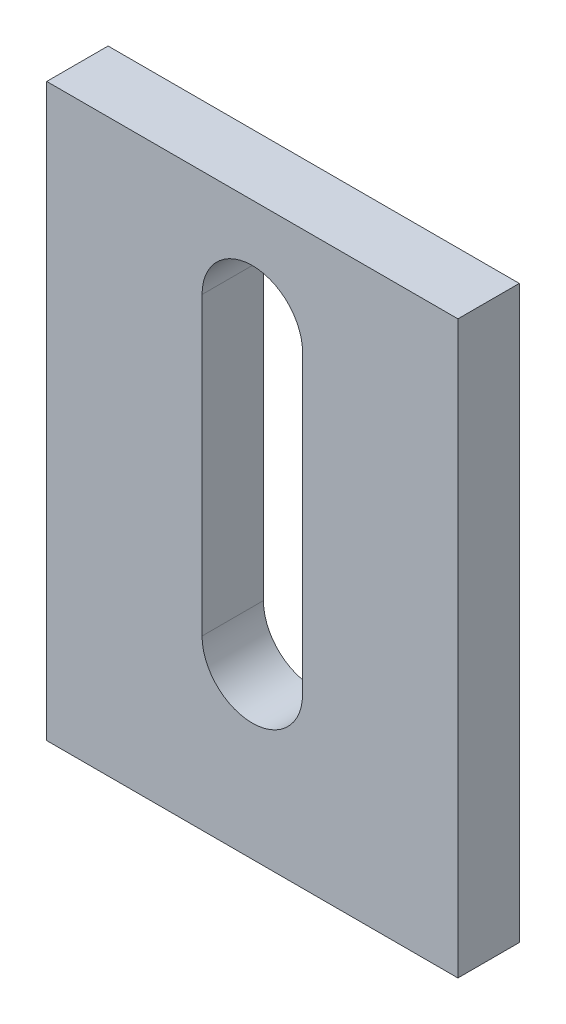
ISO-10303-21;
HEADER;
FILE_DESCRIPTION(('STEP AP214'),'2;1');
FILE_NAME('part.step','',(''),(''),'','','');
FILE_SCHEMA(('AUTOMOTIVE_DESIGN { 1 0 10303 214 1 1 1 1 }'));
ENDSEC;
DATA;
#1=APPLICATION_CONTEXT('core data for automotive mechanical design processes');
#2=APPLICATION_PROTOCOL_DEFINITION('international standard','automotive_design',2000,#1);
#3=PRODUCT_CONTEXT('',#1,'mechanical');
#4=PRODUCT('Part','Part','',(#3));
#5=PRODUCT_RELATED_PRODUCT_CATEGORY('part','',(#4));
#6=PRODUCT_DEFINITION_FORMATION('','',#4);
#7=PRODUCT_DEFINITION_CONTEXT('part definition',#1,'design');
#8=PRODUCT_DEFINITION('design','',#6,#7);
#9=PRODUCT_DEFINITION_SHAPE('','',#8);
#10=(LENGTH_UNIT() NAMED_UNIT(*) SI_UNIT(.MILLI.,.METRE.));
#11=(NAMED_UNIT(*) PLANE_ANGLE_UNIT() SI_UNIT($,.RADIAN.));
#12=(NAMED_UNIT(*) SI_UNIT($,.STERADIAN.) SOLID_ANGLE_UNIT());
#13=UNCERTAINTY_MEASURE_WITH_UNIT(LENGTH_MEASURE(1.E-05),#10,'distance_accuracy_value','');
#14=(GEOMETRIC_REPRESENTATION_CONTEXT(3) GLOBAL_UNCERTAINTY_ASSIGNED_CONTEXT((#13)) GLOBAL_UNIT_ASSIGNED_CONTEXT((#10,
#11,#12)) REPRESENTATION_CONTEXT('',''));
#15=CARTESIAN_POINT('',(0.,0.,0.));
#16=DIRECTION('',(0.,0.,1.));
#17=DIRECTION('',(1.,0.,0.));
#18=AXIS2_PLACEMENT_3D('',#15,#16,#17);
#19=CARTESIAN_POINT('',(3.,0.,4.3));
#20=DIRECTION('',(-1.,0.,0.));
#21=DIRECTION('',(0.,0.,1.));
#22=AXIS2_PLACEMENT_3D('',#19,#20,#21);
#23=PLANE('',#22);
#24=DIRECTION('',(0.,1.,0.));
#25=VECTOR('',#24,1.);
#26=CARTESIAN_POINT('',(3.,0.,0.));
#27=LINE('',#26,#25);
#28=CARTESIAN_POINT('',(3.,-40.,0.));
#29=VERTEX_POINT('',#28);
#30=CARTESIAN_POINT('',(3.,0.,0.));
#31=VERTEX_POINT('',#30);
#32=EDGE_CURVE('E143',#29,#31,#27,.T.);
#33=ORIENTED_EDGE('',*,*,#32,.F.);
#34=DIRECTION('',(0.,0.,-1.));
#35=VECTOR('',#34,1.);
#36=CARTESIAN_POINT('',(3.,-40.,4.3));
#37=LINE('',#36,#35);
#38=CARTESIAN_POINT('',(3.,-40.,4.3));
#39=VERTEX_POINT('',#38);
#40=EDGE_CURVE('E11',#39,#29,#37,.T.);
#41=ORIENTED_EDGE('',*,*,#40,.F.);
#42=DIRECTION('',(0.,1.,0.));
#43=VECTOR('',#42,1.);
#44=CARTESIAN_POINT('',(3.,0.,4.3));
#45=LINE('',#44,#43);
#46=CARTESIAN_POINT('',(3.,0.,4.3));
#47=VERTEX_POINT('',#46);
#48=EDGE_CURVE('E122',#39,#47,#45,.T.);
#49=ORIENTED_EDGE('',*,*,#48,.T.);
#50=DIRECTION('',(0.,0.,-1.));
#51=VECTOR('',#50,1.);
#52=CARTESIAN_POINT('',(3.,0.,4.3));
#53=LINE('',#52,#51);
#54=EDGE_CURVE('E54',#47,#31,#53,.T.);
#55=ORIENTED_EDGE('',*,*,#54,.T.);
#56=EDGE_LOOP('',(#33,#41,#49,#55));
#57=FACE_BOUND('',#56,.T.);
#58=ADVANCED_FACE('F35',(#57),#23,.T.);
#59=CARTESIAN_POINT('',(0.,-40.,4.3));
#60=DIRECTION('',(0.,-1.,0.));
#61=DIRECTION('',(0.,0.,-1.));
#62=AXIS2_PLACEMENT_3D('',#59,#60,#61);
#63=PLANE('',#62);
#64=DIRECTION('',(-1.,0.,0.));
#65=VECTOR('',#64,1.);
#66=CARTESIAN_POINT('',(0.,-40.,0.));
#67=LINE('',#66,#65);
#68=CARTESIAN_POINT('',(31.8124195048387,-40.,0.));
#69=VERTEX_POINT('',#68);
#70=EDGE_CURVE('E111',#69,#29,#67,.T.);
#71=ORIENTED_EDGE('',*,*,#70,.F.);
#72=DIRECTION('',(0.,0.,-1.));
#73=VECTOR('',#72,1.);
#74=CARTESIAN_POINT('',(31.8124195048387,-40.,4.3));
#75=LINE('',#74,#73);
#76=CARTESIAN_POINT('',(31.8124195048387,-40.,4.3));
#77=VERTEX_POINT('',#76);
#78=EDGE_CURVE('E45',#77,#69,#75,.T.);
#79=ORIENTED_EDGE('',*,*,#78,.F.);
#80=DIRECTION('',(-1.,0.,0.));
#81=VECTOR('',#80,1.);
#82=CARTESIAN_POINT('',(0.,-40.,4.3));
#83=LINE('',#82,#81);
#84=EDGE_CURVE('E109',#77,#39,#83,.T.);
#85=ORIENTED_EDGE('',*,*,#84,.T.);
#86=ORIENTED_EDGE('',*,*,#40,.T.);
#87=EDGE_LOOP('',(#71,#79,#85,#86));
#88=FACE_BOUND('',#87,.T.);
#89=ADVANCED_FACE('F108',(#88),#63,.T.);
#90=CARTESIAN_POINT('',(31.8124195048387,0.,4.3));
#91=DIRECTION('',(1.,0.,0.));
#92=DIRECTION('',(0.,0.,-1.));
#93=AXIS2_PLACEMENT_3D('',#90,#91,#92);
#94=PLANE('',#93);
#95=DIRECTION('',(0.,-1.,0.));
#96=VECTOR('',#95,1.);
#97=CARTESIAN_POINT('',(31.8124195048387,0.,0.));
#98=LINE('',#97,#96);
#99=CARTESIAN_POINT('',(31.8124195048387,0.,0.));
#100=VERTEX_POINT('',#99);
#101=EDGE_CURVE('E146',#100,#69,#98,.T.);
#102=ORIENTED_EDGE('',*,*,#101,.F.);
#103=DIRECTION('',(0.,0.,-1.));
#104=VECTOR('',#103,1.);
#105=CARTESIAN_POINT('',(31.8124195048387,0.,4.3));
#106=LINE('',#105,#104);
#107=CARTESIAN_POINT('',(31.8124195048387,0.,4.3));
#108=VERTEX_POINT('',#107);
#109=EDGE_CURVE('E79',#108,#100,#106,.T.);
#110=ORIENTED_EDGE('',*,*,#109,.F.);
#111=DIRECTION('',(0.,-1.,0.));
#112=VECTOR('',#111,1.);
#113=CARTESIAN_POINT('',(31.8124195048387,0.,4.3));
#114=LINE('',#113,#112);
#115=EDGE_CURVE('E121',#108,#77,#114,.T.);
#116=ORIENTED_EDGE('',*,*,#115,.T.);
#117=ORIENTED_EDGE('',*,*,#78,.T.);
#118=EDGE_LOOP('',(#102,#110,#116,#117));
#119=FACE_BOUND('',#118,.T.);
#120=ADVANCED_FACE('F124',(#119),#94,.T.);
#121=CARTESIAN_POINT('',(17.4062097524194,-28.212407831461,4.3));
#122=DIRECTION('',(0.,0.,-1.));
#123=DIRECTION('',(-1.,0.,0.));
#124=AXIS2_PLACEMENT_3D('',#121,#122,#123);
#125=CYLINDRICAL_SURFACE('',#124,3.52216237368795);
#126=CARTESIAN_POINT('',(17.4062097524194,-28.212407831461,0.));
#127=DIRECTION('',(0.,0.,1.));
#128=DIRECTION('',(1.,0.,0.));
#129=AXIS2_PLACEMENT_3D('',#126,#127,#128);
#130=CIRCLE('',#129,3.52216237368795);
#131=CARTESIAN_POINT('',(13.8840473787314,-28.212407831461,0.));
#132=VERTEX_POINT('',#131);
#133=CARTESIAN_POINT('',(20.9283721261073,-28.212407831461,0.));
#134=VERTEX_POINT('',#133);
#135=EDGE_CURVE('E131',#132,#134,#130,.T.);
#136=ORIENTED_EDGE('',*,*,#135,.F.);
#137=DIRECTION('',(0.,0.,-1.));
#138=VECTOR('',#137,1.);
#139=CARTESIAN_POINT('',(13.8840473787314,-28.212407831461,4.3));
#140=LINE('',#139,#138);
#141=CARTESIAN_POINT('',(13.8840473787314,-28.212407831461,4.3));
#142=VERTEX_POINT('',#141);
#143=EDGE_CURVE('E39',#142,#132,#140,.T.);
#144=ORIENTED_EDGE('',*,*,#143,.F.);
#145=CARTESIAN_POINT('',(17.4062097524194,-28.212407831461,4.3));
#146=DIRECTION('',(0.,0.,1.));
#147=DIRECTION('',(1.,0.,0.));
#148=AXIS2_PLACEMENT_3D('',#145,#146,#147);
#149=CIRCLE('',#148,3.52216237368795);
#150=CARTESIAN_POINT('',(20.9283721261073,-28.212407831461,4.3));
#151=VERTEX_POINT('',#150);
#152=EDGE_CURVE('E151',#142,#151,#149,.T.);
#153=ORIENTED_EDGE('',*,*,#152,.T.);
#154=DIRECTION('',(0.,0.,-1.));
#155=VECTOR('',#154,1.);
#156=CARTESIAN_POINT('',(20.9283721261073,-28.212407831461,4.3));
#157=LINE('',#156,#155);
#158=EDGE_CURVE('E127',#151,#134,#157,.T.);
#159=ORIENTED_EDGE('',*,*,#158,.T.);
#160=EDGE_LOOP('',(#136,#144,#153,#159));
#161=FACE_BOUND('',#160,.T.);
#162=ADVANCED_FACE('F37',(#161),#125,.F.);
#163=CARTESIAN_POINT('',(13.8840473787314,0.,4.3));
#164=DIRECTION('',(1.,0.,0.));
#165=DIRECTION('',(0.,0.,-1.));
#166=AXIS2_PLACEMENT_3D('',#163,#164,#165);
#167=PLANE('',#166);
#168=DIRECTION('',(0.,-1.,0.));
#169=VECTOR('',#168,1.);
#170=CARTESIAN_POINT('',(13.8840473787314,0.,0.));
#171=LINE('',#170,#169);
#172=CARTESIAN_POINT('',(13.8840473787314,-7.48759216853905,0.));
#173=VERTEX_POINT('',#172);
#174=EDGE_CURVE('E134',#173,#132,#171,.T.);
#175=ORIENTED_EDGE('',*,*,#174,.F.);
#176=DIRECTION('',(0.,0.,-1.));
#177=VECTOR('',#176,1.);
#178=CARTESIAN_POINT('',(13.8840473787314,-7.48759216853905,4.3));
#179=LINE('',#178,#177);
#180=CARTESIAN_POINT('',(13.8840473787314,-7.48759216853905,4.3));
#181=VERTEX_POINT('',#180);
#182=EDGE_CURVE('E156',#181,#173,#179,.T.);
#183=ORIENTED_EDGE('',*,*,#182,.F.);
#184=DIRECTION('',(0.,-1.,0.));
#185=VECTOR('',#184,1.);
#186=CARTESIAN_POINT('',(13.8840473787314,0.,4.3));
#187=LINE('',#186,#185);
#188=EDGE_CURVE('E165',#181,#142,#187,.T.);
#189=ORIENTED_EDGE('',*,*,#188,.T.);
#190=ORIENTED_EDGE('',*,*,#143,.T.);
#191=EDGE_LOOP('',(#175,#183,#189,#190));
#192=FACE_BOUND('',#191,.T.);
#193=ADVANCED_FACE('F163',(#192),#167,.T.);
#194=CARTESIAN_POINT('',(17.4062097524194,-7.48759216853905,4.3));
#195=DIRECTION('',(0.,0.,-1.));
#196=DIRECTION('',(-1.,0.,0.));
#197=AXIS2_PLACEMENT_3D('',#194,#195,#196);
#198=CYLINDRICAL_SURFACE('',#197,3.52216237368795);
#199=CARTESIAN_POINT('',(17.4062097524194,-7.48759216853905,0.));
#200=DIRECTION('',(0.,0.,1.));
#201=DIRECTION('',(1.,0.,0.));
#202=AXIS2_PLACEMENT_3D('',#199,#200,#201);
#203=CIRCLE('',#202,3.52216237368795);
#204=CARTESIAN_POINT('',(20.9283721261073,-7.48759216853905,0.));
#205=VERTEX_POINT('',#204);
#206=EDGE_CURVE('E137',#205,#173,#203,.T.);
#207=ORIENTED_EDGE('',*,*,#206,.F.);
#208=DIRECTION('',(0.,0.,-1.));
#209=VECTOR('',#208,1.);
#210=CARTESIAN_POINT('',(20.9283721261073,-7.48759216853905,4.3));
#211=LINE('',#210,#209);
#212=CARTESIAN_POINT('',(20.9283721261073,-7.48759216853905,4.3));
#213=VERTEX_POINT('',#212);
#214=EDGE_CURVE('E155',#213,#205,#211,.T.);
#215=ORIENTED_EDGE('',*,*,#214,.F.);
#216=CARTESIAN_POINT('',(17.4062097524194,-7.48759216853905,4.3));
#217=DIRECTION('',(0.,0.,1.));
#218=DIRECTION('',(1.,0.,0.));
#219=AXIS2_PLACEMENT_3D('',#216,#217,#218);
#220=CIRCLE('',#219,3.52216237368795);
#221=EDGE_CURVE('E174',#213,#181,#220,.T.);
#222=ORIENTED_EDGE('',*,*,#221,.T.);
#223=ORIENTED_EDGE('',*,*,#182,.T.);
#224=EDGE_LOOP('',(#207,#215,#222,#223));
#225=FACE_BOUND('',#224,.T.);
#226=ADVANCED_FACE('F171',(#225),#198,.F.);
#227=CARTESIAN_POINT('',(20.9283721261073,0.,4.3));
#228=DIRECTION('',(1.,0.,0.));
#229=DIRECTION('',(0.,0.,-1.));
#230=AXIS2_PLACEMENT_3D('',#227,#228,#229);
#231=PLANE('',#230);
#232=DIRECTION('',(0.,-1.,0.));
#233=VECTOR('',#232,1.);
#234=CARTESIAN_POINT('',(20.9283721261073,0.,0.));
#235=LINE('',#234,#233);
#236=EDGE_CURVE('E140',#205,#134,#235,.T.);
#237=ORIENTED_EDGE('',*,*,#236,.T.);
#238=ORIENTED_EDGE('',*,*,#158,.F.);
#239=DIRECTION('',(0.,-1.,0.));
#240=VECTOR('',#239,1.);
#241=CARTESIAN_POINT('',(20.9283721261073,0.,4.3));
#242=LINE('',#241,#240);
#243=EDGE_CURVE('E176',#213,#151,#242,.T.);
#244=ORIENTED_EDGE('',*,*,#243,.F.);
#245=ORIENTED_EDGE('',*,*,#214,.T.);
#246=EDGE_LOOP('',(#237,#238,#244,#245));
#247=FACE_BOUND('',#246,.T.);
#248=ADVANCED_FACE('F177',(#247),#231,.F.);
#249=CARTESIAN_POINT('',(0.,0.,4.3));
#250=DIRECTION('',(0.,1.,0.));
#251=DIRECTION('',(0.,0.,1.));
#252=AXIS2_PLACEMENT_3D('',#249,#250,#251);
#253=PLANE('',#252);
#254=DIRECTION('',(1.,0.,0.));
#255=VECTOR('',#254,1.);
#256=CARTESIAN_POINT('',(0.,0.,0.));
#257=LINE('',#256,#255);
#258=EDGE_CURVE('E148',#31,#100,#257,.T.);
#259=ORIENTED_EDGE('',*,*,#258,.F.);
#260=ORIENTED_EDGE('',*,*,#54,.F.);
#261=DIRECTION('',(1.,0.,0.));
#262=VECTOR('',#261,1.);
#263=CARTESIAN_POINT('',(0.,0.,4.3));
#264=LINE('',#263,#262);
#265=EDGE_CURVE('E125',#47,#108,#264,.T.);
#266=ORIENTED_EDGE('',*,*,#265,.T.);
#267=ORIENTED_EDGE('',*,*,#109,.T.);
#268=EDGE_LOOP('',(#259,#260,#266,#267));
#269=FACE_BOUND('',#268,.T.);
#270=ADVANCED_FACE('F183',(#269),#253,.T.);
#271=CARTESIAN_POINT('',(0.,0.,4.3));
#272=DIRECTION('',(0.,0.,1.));
#273=DIRECTION('',(1.,0.,0.));
#274=AXIS2_PLACEMENT_3D('',#271,#272,#273);
#275=PLANE('',#274);
#276=ORIENTED_EDGE('',*,*,#152,.F.);
#277=ORIENTED_EDGE('',*,*,#188,.F.);
#278=ORIENTED_EDGE('',*,*,#221,.F.);
#279=ORIENTED_EDGE('',*,*,#243,.T.);
#280=EDGE_LOOP('',(#276,#277,#278,#279));
#281=FACE_BOUND('',#280,.T.);
#282=ORIENTED_EDGE('',*,*,#48,.F.);
#283=ORIENTED_EDGE('',*,*,#84,.F.);
#284=ORIENTED_EDGE('',*,*,#115,.F.);
#285=ORIENTED_EDGE('',*,*,#265,.F.);
#286=EDGE_LOOP('',(#282,#283,#284,#285));
#287=FACE_BOUND('',#286,.T.);
#288=ADVANCED_FACE('F119',(#281,#287),#275,.T.);
#289=CARTESIAN_POINT('',(0.,0.,0.));
#290=DIRECTION('',(0.,0.,1.));
#291=DIRECTION('',(1.,0.,0.));
#292=AXIS2_PLACEMENT_3D('',#289,#290,#291);
#293=PLANE('',#292);
#294=ORIENTED_EDGE('',*,*,#135,.T.);
#295=ORIENTED_EDGE('',*,*,#236,.F.);
#296=ORIENTED_EDGE('',*,*,#206,.T.);
#297=ORIENTED_EDGE('',*,*,#174,.T.);
#298=EDGE_LOOP('',(#294,#295,#296,#297));
#299=FACE_BOUND('',#298,.T.);
#300=ORIENTED_EDGE('',*,*,#32,.T.);
#301=ORIENTED_EDGE('',*,*,#258,.T.);
#302=ORIENTED_EDGE('',*,*,#101,.T.);
#303=ORIENTED_EDGE('',*,*,#70,.T.);
#304=EDGE_LOOP('',(#300,#301,#302,#303));
#305=FACE_BOUND('',#304,.T.);
#306=ADVANCED_FACE('F169',(#299,#305),#293,.F.);
#307=CLOSED_SHELL('',(#58,#89,#120,#162,#193,#226,#248,#270,#288,#306));
#308=MANIFOLD_SOLID_BREP('B2',#307);
#309=ADVANCED_BREP_SHAPE_REPRESENTATION('',(#18,#308),#14);
#310=SHAPE_DEFINITION_REPRESENTATION(#9,#309);
ENDSEC;
END-ISO-10303-21;
